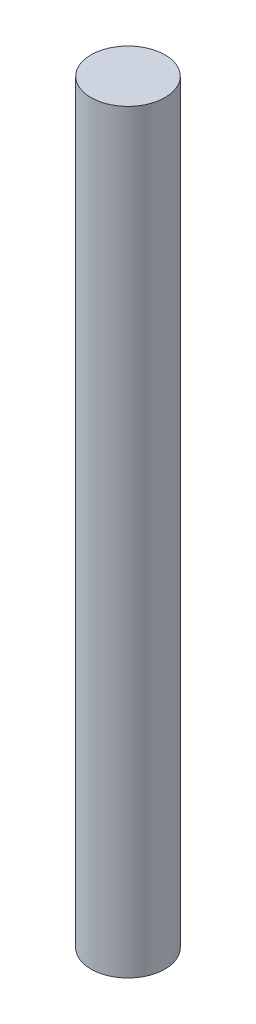
ISO-10303-21;
HEADER;
FILE_DESCRIPTION(('STEP AP214'),'2;1');
FILE_NAME('part.step','',(''),(''),'','','');
FILE_SCHEMA(('AUTOMOTIVE_DESIGN { 1 0 10303 214 1 1 1 1 }'));
ENDSEC;
DATA;
#1=APPLICATION_CONTEXT('core data for automotive mechanical design processes');
#2=APPLICATION_PROTOCOL_DEFINITION('international standard','automotive_design',2000,#1);
#3=PRODUCT_CONTEXT('',#1,'mechanical');
#4=PRODUCT('Part','Part','',(#3));
#5=PRODUCT_RELATED_PRODUCT_CATEGORY('part','',(#4));
#6=PRODUCT_DEFINITION_FORMATION('','',#4);
#7=PRODUCT_DEFINITION_CONTEXT('part definition',#1,'design');
#8=PRODUCT_DEFINITION('design','',#6,#7);
#9=PRODUCT_DEFINITION_SHAPE('','',#8);
#10=(LENGTH_UNIT() NAMED_UNIT(*) SI_UNIT(.MILLI.,.METRE.));
#11=(NAMED_UNIT(*) PLANE_ANGLE_UNIT() SI_UNIT($,.RADIAN.));
#12=(NAMED_UNIT(*) SI_UNIT($,.STERADIAN.) SOLID_ANGLE_UNIT());
#13=UNCERTAINTY_MEASURE_WITH_UNIT(LENGTH_MEASURE(1.E-05),#10,'distance_accuracy_value','');
#14=(GEOMETRIC_REPRESENTATION_CONTEXT(3) GLOBAL_UNCERTAINTY_ASSIGNED_CONTEXT((#13)) GLOBAL_UNIT_ASSIGNED_CONTEXT((#10,
#11,#12)) REPRESENTATION_CONTEXT('',''));
#15=CARTESIAN_POINT('',(0.,0.,0.));
#16=DIRECTION('',(0.,0.,1.));
#17=DIRECTION('',(1.,0.,0.));
#18=AXIS2_PLACEMENT_3D('',#15,#16,#17);
#19=CARTESIAN_POINT('',(0.,254.,0.));
#20=DIRECTION('',(0.,-1.,0.));
#21=DIRECTION('',(0.,0.,-1.));
#22=AXIS2_PLACEMENT_3D('',#19,#20,#21);
#23=CYLINDRICAL_SURFACE('',#22,12.446);
#24=CARTESIAN_POINT('',(0.,254.,0.));
#25=DIRECTION('',(0.,1.,0.));
#26=DIRECTION('',(0.,0.,1.));
#27=AXIS2_PLACEMENT_3D('',#24,#25,#26);
#28=CIRCLE('',#27,12.446);
#29=CARTESIAN_POINT('',(0.,254.,12.446));
#30=VERTEX_POINT('',#29);
#31=EDGE_CURVE('E10',#30,#30,#28,.T.);
#32=ORIENTED_EDGE('',*,*,#31,.F.);
#33=EDGE_LOOP('',(#32));
#34=FACE_BOUND('',#33,.T.);
#35=CARTESIAN_POINT('',(0.,0.,0.));
#36=DIRECTION('',(0.,1.,0.));
#37=DIRECTION('',(0.,0.,1.));
#38=AXIS2_PLACEMENT_3D('',#35,#36,#37);
#39=CIRCLE('',#38,12.446);
#40=CARTESIAN_POINT('',(0.,0.,12.446));
#41=VERTEX_POINT('',#40);
#42=EDGE_CURVE('E37',#41,#41,#39,.T.);
#43=ORIENTED_EDGE('',*,*,#42,.T.);
#44=EDGE_LOOP('',(#43));
#45=FACE_BOUND('',#44,.T.);
#46=ADVANCED_FACE('F34',(#34,#45),#23,.T.);
#47=CARTESIAN_POINT('',(0.,254.,0.));
#48=DIRECTION('',(0.,1.,0.));
#49=DIRECTION('',(0.,0.,1.));
#50=AXIS2_PLACEMENT_3D('',#47,#48,#49);
#51=PLANE('',#50);
#52=ORIENTED_EDGE('',*,*,#31,.T.);
#53=EDGE_LOOP('',(#52));
#54=FACE_BOUND('',#53,.T.);
#55=ADVANCED_FACE('F49',(#54),#51,.T.);
#56=CARTESIAN_POINT('',(0.,0.,0.));
#57=DIRECTION('',(0.,1.,0.));
#58=DIRECTION('',(0.,0.,1.));
#59=AXIS2_PLACEMENT_3D('',#56,#57,#58);
#60=PLANE('',#59);
#61=ORIENTED_EDGE('',*,*,#42,.F.);
#62=EDGE_LOOP('',(#61));
#63=FACE_BOUND('',#62,.T.);
#64=ADVANCED_FACE('F47',(#63),#60,.F.);
#65=CLOSED_SHELL('',(#46,#55,#64));
#66=MANIFOLD_SOLID_BREP('B2',#65);
#67=ADVANCED_BREP_SHAPE_REPRESENTATION('',(#18,#66),#14);
#68=SHAPE_DEFINITION_REPRESENTATION(#9,#67);
ENDSEC;
END-ISO-10303-21;
